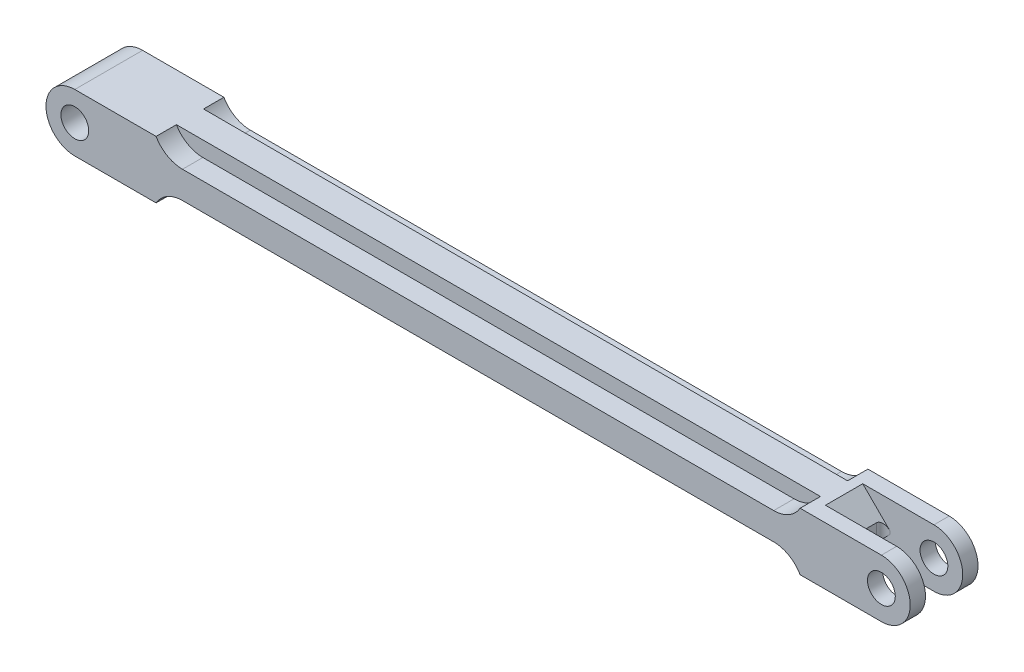
ISO-10303-21;
HEADER;
FILE_DESCRIPTION(('STEP AP214'),'2;1');
FILE_NAME('part.step','',(''),(''),'','','');
FILE_SCHEMA(('AUTOMOTIVE_DESIGN { 1 0 10303 214 1 1 1 1 }'));
ENDSEC;
DATA;
#1=APPLICATION_CONTEXT('core data for automotive mechanical design processes');
#2=APPLICATION_PROTOCOL_DEFINITION('international standard','automotive_design',2000,#1);
#3=PRODUCT_CONTEXT('',#1,'mechanical');
#4=PRODUCT('Part','Part','',(#3));
#5=PRODUCT_RELATED_PRODUCT_CATEGORY('part','',(#4));
#6=PRODUCT_DEFINITION_FORMATION('','',#4);
#7=PRODUCT_DEFINITION_CONTEXT('part definition',#1,'design');
#8=PRODUCT_DEFINITION('design','',#6,#7);
#9=PRODUCT_DEFINITION_SHAPE('','',#8);
#10=(LENGTH_UNIT() NAMED_UNIT(*) SI_UNIT(.MILLI.,.METRE.));
#11=(NAMED_UNIT(*) PLANE_ANGLE_UNIT() SI_UNIT($,.RADIAN.));
#12=(NAMED_UNIT(*) SI_UNIT($,.STERADIAN.) SOLID_ANGLE_UNIT());
#13=UNCERTAINTY_MEASURE_WITH_UNIT(LENGTH_MEASURE(1.E-05),#10,'distance_accuracy_value','');
#14=(GEOMETRIC_REPRESENTATION_CONTEXT(3) GLOBAL_UNCERTAINTY_ASSIGNED_CONTEXT((#13)) GLOBAL_UNIT_ASSIGNED_CONTEXT((#10,
#11,#12)) REPRESENTATION_CONTEXT('',''));
#15=CARTESIAN_POINT('',(0.,0.,0.));
#16=DIRECTION('',(0.,0.,1.));
#17=DIRECTION('',(1.,0.,0.));
#18=AXIS2_PLACEMENT_3D('',#15,#16,#17);
#19=CARTESIAN_POINT('',(-29.0717121826814,171.373872766802,10.));
#20=DIRECTION('',(0.,1.,0.));
#21=DIRECTION('',(0.,0.,1.));
#22=AXIS2_PLACEMENT_3D('',#19,#20,#21);
#23=PLANE('',#22);
#24=DIRECTION('',(-1.,0.,0.));
#25=VECTOR('',#24,1.);
#26=CARTESIAN_POINT('',(217.38140451995,171.373872766802,-5.5));
#27=LINE('',#26,#25);
#28=CARTESIAN_POINT('',(208.88140451995,171.373872766802,-5.5));
#29=VERTEX_POINT('',#28);
#30=CARTESIAN_POINT('',(187.88140451995,171.373872766802,-5.5));
#31=VERTEX_POINT('',#30);
#32=EDGE_CURVE('E220',#29,#31,#27,.T.);
#33=ORIENTED_EDGE('',*,*,#32,.T.);
#34=DIRECTION('',(0.,0.,1.));
#35=VECTOR('',#34,1.);
#36=CARTESIAN_POINT('',(187.88140451995,171.373872766802,-5.5));
#37=LINE('',#36,#35);
#38=CARTESIAN_POINT('',(187.88140451995,171.373872766802,5.5));
#39=VERTEX_POINT('',#38);
#40=EDGE_CURVE('E222',#31,#39,#37,.T.);
#41=ORIENTED_EDGE('',*,*,#40,.T.);
#42=DIRECTION('',(1.,0.,0.));
#43=VECTOR('',#42,1.);
#44=CARTESIAN_POINT('',(217.38140451995,171.373872766802,5.5));
#45=LINE('',#44,#43);
#46=CARTESIAN_POINT('',(208.88140451995,171.373872766802,5.5));
#47=VERTEX_POINT('',#46);
#48=EDGE_CURVE('E226',#39,#47,#45,.T.);
#49=ORIENTED_EDGE('',*,*,#48,.T.);
#50=DIRECTION('',(0.,0.,-1.));
#51=VECTOR('',#50,1.);
#52=CARTESIAN_POINT('',(208.88140451995,171.373872766802,10.));
#53=LINE('',#52,#51);
#54=CARTESIAN_POINT('',(208.88140451995,171.373872766802,10.));
#55=VERTEX_POINT('',#54);
#56=EDGE_CURVE('E284',#55,#47,#53,.T.);
#57=ORIENTED_EDGE('',*,*,#56,.F.);
#58=DIRECTION('',(1.,0.,0.));
#59=VECTOR('',#58,1.);
#60=CARTESIAN_POINT('',(-29.0717121826814,171.373872766802,10.));
#61=LINE('',#60,#59);
#62=CARTESIAN_POINT('',(184.904846168634,171.373872766802,10.));
#63=VERTEX_POINT('',#62);
#64=EDGE_CURVE('E297',#63,#55,#61,.T.);
#65=ORIENTED_EDGE('',*,*,#64,.F.);
#66=DIRECTION('',(0.,0.,-1.));
#67=VECTOR('',#66,1.);
#68=CARTESIAN_POINT('',(184.904846168634,171.373872766802,10.));
#69=LINE('',#68,#67);
#70=CARTESIAN_POINT('',(184.904846168634,171.373872766802,4.00000000000001));
#71=VERTEX_POINT('',#70);
#72=EDGE_CURVE('E311',#63,#71,#69,.T.);
#73=ORIENTED_EDGE('',*,*,#72,.T.);
#74=DIRECTION('',(-1.,0.,0.));
#75=VECTOR('',#74,1.);
#76=CARTESIAN_POINT('',(211.153655665448,171.373872766802,4.00000000000001));
#77=LINE('',#76,#75);
#78=CARTESIAN_POINT('',(-5.09515383136561,171.373872766802,4.00000000000001));
#79=VERTEX_POINT('',#78);
#80=EDGE_CURVE('E332',#71,#79,#77,.T.);
#81=ORIENTED_EDGE('',*,*,#80,.T.);
#82=DIRECTION('',(0.,0.,1.));
#83=VECTOR('',#82,1.);
#84=CARTESIAN_POINT('',(-5.09515383136561,171.373872766802,10.));
#85=LINE('',#84,#83);
#86=CARTESIAN_POINT('',(-5.09515383136561,171.373872766802,10.));
#87=VERTEX_POINT('',#86);
#88=EDGE_CURVE('E352',#79,#87,#85,.T.);
#89=ORIENTED_EDGE('',*,*,#88,.T.);
#90=DIRECTION('',(1.,0.,0.));
#91=VECTOR('',#90,1.);
#92=CARTESIAN_POINT('',(-29.0717121826814,171.373872766802,10.));
#93=LINE('',#92,#91);
#94=CARTESIAN_POINT('',(-29.0717121826814,171.373872766802,10.));
#95=VERTEX_POINT('',#94);
#96=EDGE_CURVE('E367',#95,#87,#93,.T.);
#97=ORIENTED_EDGE('',*,*,#96,.F.);
#98=DIRECTION('',(0.,0.,-1.));
#99=VECTOR('',#98,1.);
#100=CARTESIAN_POINT('',(-29.0717121826814,171.373872766802,10.));
#101=LINE('',#100,#99);
#102=CARTESIAN_POINT('',(-29.0717121826814,171.373872766802,-10.));
#103=VERTEX_POINT('',#102);
#104=EDGE_CURVE('E382',#95,#103,#101,.T.);
#105=ORIENTED_EDGE('',*,*,#104,.T.);
#106=DIRECTION('',(1.,0.,0.));
#107=VECTOR('',#106,1.);
#108=CARTESIAN_POINT('',(-29.0717121826814,171.373872766802,-10.));
#109=LINE('',#108,#107);
#110=CARTESIAN_POINT('',(-5.09515383136561,171.373872766802,-10.));
#111=VERTEX_POINT('',#110);
#112=EDGE_CURVE('E376',#103,#111,#109,.T.);
#113=ORIENTED_EDGE('',*,*,#112,.T.);
#114=CARTESIAN_POINT('',(-5.09515383136561,171.373872766802,-4.));
#115=VERTEX_POINT('',#114);
#116=EDGE_CURVE('E355',#111,#115,#85,.T.);
#117=ORIENTED_EDGE('',*,*,#116,.T.);
#118=DIRECTION('',(-1.,0.,0.));
#119=VECTOR('',#118,1.);
#120=CARTESIAN_POINT('',(211.153655665448,171.373872766802,-4.));
#121=LINE('',#120,#119);
#122=CARTESIAN_POINT('',(184.904846168634,171.373872766802,-4.));
#123=VERTEX_POINT('',#122);
#124=EDGE_CURVE('E335',#123,#115,#121,.T.);
#125=ORIENTED_EDGE('',*,*,#124,.F.);
#126=CARTESIAN_POINT('',(184.904846168634,171.373872766802,-10.));
#127=VERTEX_POINT('',#126);
#128=EDGE_CURVE('E301',#123,#127,#69,.T.);
#129=ORIENTED_EDGE('',*,*,#128,.T.);
#130=DIRECTION('',(1.,0.,0.));
#131=VECTOR('',#130,1.);
#132=CARTESIAN_POINT('',(-29.0717121826814,171.373872766802,-10.));
#133=LINE('',#132,#131);
#134=CARTESIAN_POINT('',(208.88140451995,171.373872766802,-10.));
#135=VERTEX_POINT('',#134);
#136=EDGE_CURVE('E227',#127,#135,#133,.T.);
#137=ORIENTED_EDGE('',*,*,#136,.T.);
#138=EDGE_CURVE('E224',#29,#135,#53,.T.);
#139=ORIENTED_EDGE('',*,*,#138,.F.);
#140=EDGE_LOOP('',(#33,#41,#49,#57,#65,#73,#81,#89,#97,#105,#113,#117,#125,#129,#137,#139));
#141=FACE_BOUND('',#140,.T.);
#142=ADVANCED_FACE('F32',(#141),#23,.F.);
#143=CARTESIAN_POINT('',(193.88140451995,171.373872766802,-5.5));
#144=DIRECTION('',(-1.,0.,0.));
#145=DIRECTION('',(0.,0.,1.));
#146=AXIS2_PLACEMENT_3D('',#143,#144,#145);
#147=PLANE('',#146);
#148=DIRECTION('',(0.,0.,1.));
#149=VECTOR('',#148,1.);
#150=CARTESIAN_POINT('',(193.88140451995,177.373872766802,-5.5));
#151=LINE('',#150,#149);
#152=CARTESIAN_POINT('',(193.88140451995,177.373872766802,-3.5));
#153=VERTEX_POINT('',#152);
#154=CARTESIAN_POINT('',(193.88140451995,177.373872766802,3.5));
#155=VERTEX_POINT('',#154);
#156=EDGE_CURVE('E236',#153,#155,#151,.T.);
#157=ORIENTED_EDGE('',*,*,#156,.F.);
#158=DIRECTION('',(0.,1.,0.));
#159=VECTOR('',#158,1.);
#160=CARTESIAN_POINT('',(193.88140451995,188.373872766802,-3.5));
#161=LINE('',#160,#159);
#162=CARTESIAN_POINT('',(193.88140451995,182.373872766802,-3.5));
#163=VERTEX_POINT('',#162);
#164=EDGE_CURVE('E271',#153,#163,#161,.T.);
#165=ORIENTED_EDGE('',*,*,#164,.T.);
#166=DIRECTION('',(0.,0.,1.));
#167=VECTOR('',#166,1.);
#168=CARTESIAN_POINT('',(193.88140451995,182.373872766802,-5.5));
#169=LINE('',#168,#167);
#170=CARTESIAN_POINT('',(193.88140451995,182.373872766802,3.5));
#171=VERTEX_POINT('',#170);
#172=EDGE_CURVE('E254',#163,#171,#169,.T.);
#173=ORIENTED_EDGE('',*,*,#172,.T.);
#174=DIRECTION('',(0.,1.,0.));
#175=VECTOR('',#174,1.);
#176=CARTESIAN_POINT('',(193.88140451995,171.373872766802,3.5));
#177=LINE('',#176,#175);
#178=EDGE_CURVE('E267',#171,#155,#177,.F.);
#179=ORIENTED_EDGE('',*,*,#178,.T.);
#180=EDGE_LOOP('',(#157,#165,#173,#179));
#181=FACE_BOUND('',#180,.T.);
#182=ADVANCED_FACE('F449',(#181),#147,.F.);
#183=CARTESIAN_POINT('',(195.88140451995,171.373872766802,3.5));
#184=DIRECTION('',(0.,-1.,0.));
#185=DIRECTION('',(0.,0.,-1.));
#186=AXIS2_PLACEMENT_3D('',#183,#184,#185);
#187=CYLINDRICAL_SURFACE('',#186,2.);
#188=CARTESIAN_POINT('',(195.88140451995,179.373872766802,3.5));
#189=DIRECTION('',(0.707106781186543,-0.707106781186552,0.));
#190=DIRECTION('',(-0.707106781186552,-0.707106781186543,0.));
#191=AXIS2_PLACEMENT_3D('',#188,#189,#190);
#192=ELLIPSE('',#191,2.82842712474617,2.);
#193=CARTESIAN_POINT('',(195.88140451995,179.373872766802,5.5));
#194=VERTEX_POINT('',#193);
#195=EDGE_CURVE('E245',#155,#194,#192,.F.);
#196=ORIENTED_EDGE('',*,*,#195,.F.);
#197=ORIENTED_EDGE('',*,*,#178,.F.);
#198=CARTESIAN_POINT('',(195.88140451995,180.373872766802,3.5));
#199=DIRECTION('',(-0.707106781186543,-0.707106781186552,0.));
#200=DIRECTION('',(0.707106781186552,-0.707106781186543,0.));
#201=AXIS2_PLACEMENT_3D('',#198,#199,#200);
#202=ELLIPSE('',#201,2.82842712474617,2.);
#203=CARTESIAN_POINT('',(195.88140451995,180.373872766802,5.5));
#204=VERTEX_POINT('',#203);
#205=EDGE_CURVE('E257',#171,#204,#202,.F.);
#206=ORIENTED_EDGE('',*,*,#205,.T.);
#207=DIRECTION('',(0.,1.,0.));
#208=VECTOR('',#207,1.);
#209=CARTESIAN_POINT('',(195.88140451995,188.373872766802,5.5));
#210=LINE('',#209,#208);
#211=EDGE_CURVE('E274',#194,#204,#210,.T.);
#212=ORIENTED_EDGE('',*,*,#211,.F.);
#213=EDGE_LOOP('',(#196,#197,#206,#212));
#214=FACE_BOUND('',#213,.T.);
#215=ADVANCED_FACE('F452',(#214),#187,.F.);
#216=CARTESIAN_POINT('',(195.88140451995,171.373872766802,-3.5));
#217=DIRECTION('',(0.,-1.,0.));
#218=DIRECTION('',(0.,0.,-1.));
#219=AXIS2_PLACEMENT_3D('',#216,#217,#218);
#220=CYLINDRICAL_SURFACE('',#219,2.);
#221=CARTESIAN_POINT('',(195.88140451995,179.373872766802,-3.5));
#222=DIRECTION('',(0.707106781186543,-0.707106781186552,0.));
#223=DIRECTION('',(-0.707106781186552,-0.707106781186543,0.));
#224=AXIS2_PLACEMENT_3D('',#221,#222,#223);
#225=ELLIPSE('',#224,2.82842712474617,2.);
#226=CARTESIAN_POINT('',(195.88140451995,179.373872766802,-5.5));
#227=VERTEX_POINT('',#226);
#228=EDGE_CURVE('E11',#227,#153,#225,.F.);
#229=ORIENTED_EDGE('',*,*,#228,.F.);
#230=DIRECTION('',(0.,1.,0.));
#231=VECTOR('',#230,1.);
#232=CARTESIAN_POINT('',(195.88140451995,171.373872766802,-5.5));
#233=LINE('',#232,#231);
#234=CARTESIAN_POINT('',(195.88140451995,180.373872766802,-5.5));
#235=VERTEX_POINT('',#234);
#236=EDGE_CURVE('E240',#235,#227,#233,.F.);
#237=ORIENTED_EDGE('',*,*,#236,.F.);
#238=CARTESIAN_POINT('',(195.88140451995,180.373872766802,-3.5));
#239=DIRECTION('',(-0.707106781186543,-0.707106781186552,0.));
#240=DIRECTION('',(0.707106781186552,-0.707106781186543,0.));
#241=AXIS2_PLACEMENT_3D('',#238,#239,#240);
#242=ELLIPSE('',#241,2.82842712474617,2.);
#243=EDGE_CURVE('E40',#235,#163,#242,.F.);
#244=ORIENTED_EDGE('',*,*,#243,.T.);
#245=ORIENTED_EDGE('',*,*,#164,.F.);
#246=EDGE_LOOP('',(#229,#237,#244,#245));
#247=FACE_BOUND('',#246,.T.);
#248=ADVANCED_FACE('F441',(#247),#220,.F.);
#249=CARTESIAN_POINT('',(-29.0717121826814,188.373872766802,10.));
#250=DIRECTION('',(0.,-1.,0.));
#251=DIRECTION('',(0.,0.,-1.));
#252=AXIS2_PLACEMENT_3D('',#249,#250,#251);
#253=PLANE('',#252);
#254=DIRECTION('',(0.,0.,1.));
#255=VECTOR('',#254,1.);
#256=CARTESIAN_POINT('',(187.88140451995,188.373872766802,-5.5));
#257=LINE('',#256,#255);
#258=CARTESIAN_POINT('',(187.88140451995,188.373872766802,-5.5));
#259=VERTEX_POINT('',#258);
#260=CARTESIAN_POINT('',(187.88140451995,188.373872766802,5.5));
#261=VERTEX_POINT('',#260);
#262=EDGE_CURVE('E249',#259,#261,#257,.T.);
#263=ORIENTED_EDGE('',*,*,#262,.F.);
#264=DIRECTION('',(-1.,0.,0.));
#265=VECTOR('',#264,1.);
#266=CARTESIAN_POINT('',(217.38140451995,188.373872766802,-5.5));
#267=LINE('',#266,#265);
#268=CARTESIAN_POINT('',(208.88140451995,188.373872766802,-5.5));
#269=VERTEX_POINT('',#268);
#270=EDGE_CURVE('E268',#269,#259,#267,.T.);
#271=ORIENTED_EDGE('',*,*,#270,.F.);
#272=DIRECTION('',(0.,0.,-1.));
#273=VECTOR('',#272,1.);
#274=CARTESIAN_POINT('',(208.88140451995,188.373872766802,10.));
#275=LINE('',#274,#273);
#276=CARTESIAN_POINT('',(208.88140451995,188.373872766802,-10.));
#277=VERTEX_POINT('',#276);
#278=EDGE_CURVE('E280',#269,#277,#275,.T.);
#279=ORIENTED_EDGE('',*,*,#278,.T.);
#280=DIRECTION('',(-1.,0.,0.));
#281=VECTOR('',#280,1.);
#282=CARTESIAN_POINT('',(-29.0717121826814,188.373872766802,-10.));
#283=LINE('',#282,#281);
#284=CARTESIAN_POINT('',(184.904846168634,188.373872766802,-10.));
#285=VERTEX_POINT('',#284);
#286=EDGE_CURVE('E293',#277,#285,#283,.T.);
#287=ORIENTED_EDGE('',*,*,#286,.T.);
#288=DIRECTION('',(0.,0.,1.));
#289=VECTOR('',#288,1.);
#290=CARTESIAN_POINT('',(184.904846168634,188.373872766802,10.));
#291=LINE('',#290,#289);
#292=CARTESIAN_POINT('',(184.904846168634,188.373872766802,-4.));
#293=VERTEX_POINT('',#292);
#294=EDGE_CURVE('E261',#285,#293,#291,.T.);
#295=ORIENTED_EDGE('',*,*,#294,.T.);
#296=DIRECTION('',(-1.,0.,0.));
#297=VECTOR('',#296,1.);
#298=CARTESIAN_POINT('',(211.153655665448,188.373872766802,-4.));
#299=LINE('',#298,#297);
#300=CARTESIAN_POINT('',(-5.09515383136561,188.373872766802,-4.));
#301=VERTEX_POINT('',#300);
#302=EDGE_CURVE('E349',#293,#301,#299,.T.);
#303=ORIENTED_EDGE('',*,*,#302,.T.);
#304=DIRECTION('',(0.,0.,-1.));
#305=VECTOR('',#304,1.);
#306=CARTESIAN_POINT('',(-5.09515383136561,188.373872766802,10.));
#307=LINE('',#306,#305);
#308=CARTESIAN_POINT('',(-5.09515383136561,188.373872766802,-10.));
#309=VERTEX_POINT('',#308);
#310=EDGE_CURVE('E385',#301,#309,#307,.T.);
#311=ORIENTED_EDGE('',*,*,#310,.T.);
#312=DIRECTION('',(-1.,0.,0.));
#313=VECTOR('',#312,1.);
#314=CARTESIAN_POINT('',(-29.0717121826814,188.373872766802,-10.));
#315=LINE('',#314,#313);
#316=CARTESIAN_POINT('',(-29.0717121826814,188.373872766802,-10.));
#317=VERTEX_POINT('',#316);
#318=EDGE_CURVE('E368',#309,#317,#315,.T.);
#319=ORIENTED_EDGE('',*,*,#318,.T.);
#320=DIRECTION('',(0.,0.,-1.));
#321=VECTOR('',#320,1.);
#322=CARTESIAN_POINT('',(-29.0717121826814,188.373872766802,10.));
#323=LINE('',#322,#321);
#324=CARTESIAN_POINT('',(-29.0717121826814,188.373872766802,10.));
#325=VERTEX_POINT('',#324);
#326=EDGE_CURVE('E373',#325,#317,#323,.T.);
#327=ORIENTED_EDGE('',*,*,#326,.F.);
#328=DIRECTION('',(-1.,0.,0.));
#329=VECTOR('',#328,1.);
#330=CARTESIAN_POINT('',(-29.0717121826814,188.373872766802,10.));
#331=LINE('',#330,#329);
#332=CARTESIAN_POINT('',(-5.09515383136561,188.373872766802,10.));
#333=VERTEX_POINT('',#332);
#334=EDGE_CURVE('E371',#333,#325,#331,.T.);
#335=ORIENTED_EDGE('',*,*,#334,.F.);
#336=CARTESIAN_POINT('',(-5.09515383136561,188.373872766802,4.));
#337=VERTEX_POINT('',#336);
#338=EDGE_CURVE('E386',#333,#337,#307,.T.);
#339=ORIENTED_EDGE('',*,*,#338,.T.);
#340=DIRECTION('',(-1.,0.,0.));
#341=VECTOR('',#340,1.);
#342=CARTESIAN_POINT('',(211.153655665448,188.373872766802,4.));
#343=LINE('',#342,#341);
#344=CARTESIAN_POINT('',(184.904846168634,188.373872766802,4.));
#345=VERTEX_POINT('',#344);
#346=EDGE_CURVE('E273',#345,#337,#343,.T.);
#347=ORIENTED_EDGE('',*,*,#346,.F.);
#348=CARTESIAN_POINT('',(184.904846168634,188.373872766802,10.));
#349=VERTEX_POINT('',#348);
#350=EDGE_CURVE('E265',#345,#349,#291,.T.);
#351=ORIENTED_EDGE('',*,*,#350,.T.);
#352=DIRECTION('',(-1.,0.,0.));
#353=VECTOR('',#352,1.);
#354=CARTESIAN_POINT('',(-29.0717121826814,188.373872766802,10.));
#355=LINE('',#354,#353);
#356=CARTESIAN_POINT('',(208.88140451995,188.373872766802,10.));
#357=VERTEX_POINT('',#356);
#358=EDGE_CURVE('E296',#357,#349,#355,.T.);
#359=ORIENTED_EDGE('',*,*,#358,.F.);
#360=CARTESIAN_POINT('',(208.88140451995,188.373872766802,5.5));
#361=VERTEX_POINT('',#360);
#362=EDGE_CURVE('E264',#357,#361,#275,.T.);
#363=ORIENTED_EDGE('',*,*,#362,.T.);
#364=DIRECTION('',(1.,0.,0.));
#365=VECTOR('',#364,1.);
#366=CARTESIAN_POINT('',(217.38140451995,188.373872766802,5.5));
#367=LINE('',#366,#365);
#368=EDGE_CURVE('E276',#261,#361,#367,.T.);
#369=ORIENTED_EDGE('',*,*,#368,.F.);
#370=EDGE_LOOP('',(#263,#271,#279,#287,#295,#303,#311,#319,#327,#335,#339,#347,#351,#359,#363,#369));
#371=FACE_BOUND('',#370,.T.);
#372=ADVANCED_FACE('F506',(#371),#253,.F.);
#373=CARTESIAN_POINT('',(-29.0717121826814,179.873872766802,10.));
#374=DIRECTION('',(0.,0.,-1.));
#375=DIRECTION('',(-1.,0.,0.));
#376=AXIS2_PLACEMENT_3D('',#373,#374,#375);
#377=CYLINDRICAL_SURFACE('',#376,4.1);
#378=CARTESIAN_POINT('',(-29.0717121826814,179.873872766802,10.));
#379=DIRECTION('',(0.,0.,1.));
#380=DIRECTION('',(1.,0.,0.));
#381=AXIS2_PLACEMENT_3D('',#378,#379,#380);
#382=CIRCLE('',#381,4.1);
#383=CARTESIAN_POINT('',(-24.9717121826814,179.873872766802,10.));
#384=VERTEX_POINT('',#383);
#385=EDGE_CURVE('E358',#384,#384,#382,.T.);
#386=ORIENTED_EDGE('',*,*,#385,.T.);
#387=EDGE_LOOP('',(#386));
#388=FACE_BOUND('',#387,.T.);
#389=CARTESIAN_POINT('',(-29.0717121826814,179.873872766802,-10.));
#390=DIRECTION('',(0.,0.,1.));
#391=DIRECTION('',(1.,0.,0.));
#392=AXIS2_PLACEMENT_3D('',#389,#390,#391);
#393=CIRCLE('',#392,4.1);
#394=CARTESIAN_POINT('',(-24.9717121826814,179.873872766802,-10.));
#395=VERTEX_POINT('',#394);
#396=EDGE_CURVE('E357',#395,#395,#393,.T.);
#397=ORIENTED_EDGE('',*,*,#396,.F.);
#398=EDGE_LOOP('',(#397));
#399=FACE_BOUND('',#398,.T.);
#400=ADVANCED_FACE('F512',(#388,#399),#377,.F.);
#401=CARTESIAN_POINT('',(-29.0717121826814,179.873872766802,10.));
#402=DIRECTION('',(0.,0.,-1.));
#403=DIRECTION('',(-1.,0.,0.));
#404=AXIS2_PLACEMENT_3D('',#401,#402,#403);
#405=CYLINDRICAL_SURFACE('',#404,8.50000000000001);
#406=CARTESIAN_POINT('',(-29.0717121826814,179.873872766802,-10.));
#407=DIRECTION('',(0.,0.,1.));
#408=DIRECTION('',(1.,0.,0.));
#409=AXIS2_PLACEMENT_3D('',#406,#407,#408);
#410=CIRCLE('',#409,8.50000000000001);
#411=EDGE_CURVE('E361',#317,#103,#410,.T.);
#412=ORIENTED_EDGE('',*,*,#411,.T.);
#413=ORIENTED_EDGE('',*,*,#104,.F.);
#414=CARTESIAN_POINT('',(-29.0717121826814,179.873872766802,10.));
#415=DIRECTION('',(0.,0.,1.));
#416=DIRECTION('',(1.,0.,0.));
#417=AXIS2_PLACEMENT_3D('',#414,#415,#416);
#418=CIRCLE('',#417,8.50000000000001);
#419=EDGE_CURVE('E364',#325,#95,#418,.T.);
#420=ORIENTED_EDGE('',*,*,#419,.F.);
#421=ORIENTED_EDGE('',*,*,#326,.T.);
#422=EDGE_LOOP('',(#412,#413,#420,#421));
#423=FACE_BOUND('',#422,.T.);
#424=ADVANCED_FACE('F508',(#423),#405,.T.);
#425=CARTESIAN_POINT('',(-29.0717121826814,179.873872766802,-10.));
#426=DIRECTION('',(0.,0.,1.));
#427=DIRECTION('',(1.,0.,0.));
#428=AXIS2_PLACEMENT_3D('',#425,#426,#427);
#429=PLANE('',#428);
#430=ORIENTED_EDGE('',*,*,#396,.T.);
#431=EDGE_LOOP('',(#430));
#432=FACE_BOUND('',#431,.T.);
#433=ORIENTED_EDGE('',*,*,#318,.F.);
#434=CARTESIAN_POINT('',(2.69907480269432,192.873872766802,-10.));
#435=DIRECTION('',(0.,0.,1.));
#436=DIRECTION('',(1.,0.,0.));
#437=AXIS2_PLACEMENT_3D('',#434,#435,#436);
#438=CIRCLE('',#437,9.);
#439=CARTESIAN_POINT('',(2.69907480269438,183.873872766802,-10.));
#440=VERTEX_POINT('',#439);
#441=EDGE_CURVE('E55',#309,#440,#438,.T.);
#442=ORIENTED_EDGE('',*,*,#441,.T.);
#443=DIRECTION('',(-1.,0.,0.));
#444=VECTOR('',#443,1.);
#445=CARTESIAN_POINT('',(211.153655665448,183.873872766802,-10.));
#446=LINE('',#445,#444);
#447=CARTESIAN_POINT('',(177.110617534574,183.873872766802,-10.));
#448=VERTEX_POINT('',#447);
#449=EDGE_CURVE('E344',#448,#440,#446,.T.);
#450=ORIENTED_EDGE('',*,*,#449,.F.);
#451=CARTESIAN_POINT('',(177.110617534574,192.873872766802,-10.));
#452=DIRECTION('',(0.,0.,1.));
#453=DIRECTION('',(1.,0.,0.));
#454=AXIS2_PLACEMENT_3D('',#451,#452,#453);
#455=CIRCLE('',#454,9.);
#456=EDGE_CURVE('E430',#448,#285,#455,.T.);
#457=ORIENTED_EDGE('',*,*,#456,.T.);
#458=ORIENTED_EDGE('',*,*,#286,.F.);
#459=CARTESIAN_POINT('',(208.88140451995,179.873872766802,-10.));
#460=DIRECTION('',(0.,0.,1.));
#461=DIRECTION('',(1.,0.,0.));
#462=AXIS2_PLACEMENT_3D('',#459,#460,#461);
#463=CIRCLE('',#462,8.50000000000001);
#464=EDGE_CURVE('E290',#135,#277,#463,.T.);
#465=ORIENTED_EDGE('',*,*,#464,.F.);
#466=ORIENTED_EDGE('',*,*,#136,.F.);
#467=CARTESIAN_POINT('',(177.110617534574,166.873872766802,-10.));
#468=DIRECTION('',(0.,0.,1.));
#469=DIRECTION('',(1.,0.,0.));
#470=AXIS2_PLACEMENT_3D('',#467,#468,#469);
#471=CIRCLE('',#470,9.);
#472=CARTESIAN_POINT('',(177.110617534574,175.873872766802,-10.));
#473=VERTEX_POINT('',#472);
#474=EDGE_CURVE('E426',#127,#473,#471,.T.);
#475=ORIENTED_EDGE('',*,*,#474,.T.);
#476=DIRECTION('',(-1.,0.,0.));
#477=VECTOR('',#476,1.);
#478=CARTESIAN_POINT('',(211.153655665448,175.873872766802,-10.));
#479=LINE('',#478,#477);
#480=CARTESIAN_POINT('',(2.69907480269441,175.873872766802,-10.));
#481=VERTEX_POINT('',#480);
#482=EDGE_CURVE('E341',#473,#481,#479,.T.);
#483=ORIENTED_EDGE('',*,*,#482,.T.);
#484=CARTESIAN_POINT('',(2.69907480269435,166.873872766802,-10.));
#485=DIRECTION('',(0.,0.,1.));
#486=DIRECTION('',(1.,0.,0.));
#487=AXIS2_PLACEMENT_3D('',#484,#485,#486);
#488=CIRCLE('',#487,9.);
#489=EDGE_CURVE('E432',#481,#111,#488,.T.);
#490=ORIENTED_EDGE('',*,*,#489,.T.);
#491=ORIENTED_EDGE('',*,*,#112,.F.);
#492=ORIENTED_EDGE('',*,*,#411,.F.);
#493=EDGE_LOOP('',(#433,#442,#450,#457,#458,#465,#466,#475,#483,#490,#491,#492));
#494=FACE_BOUND('',#493,.T.);
#495=CARTESIAN_POINT('',(208.88140451995,179.873872766802,-10.));
#496=DIRECTION('',(0.,0.,1.));
#497=DIRECTION('',(1.,0.,0.));
#498=AXIS2_PLACEMENT_3D('',#495,#496,#497);
#499=CIRCLE('',#498,4.09999999999998);
#500=CARTESIAN_POINT('',(212.98140451995,179.873872766802,-10.));
#501=VERTEX_POINT('',#500);
#502=EDGE_CURVE('E298',#501,#501,#499,.T.);
#503=ORIENTED_EDGE('',*,*,#502,.T.);
#504=EDGE_LOOP('',(#503));
#505=FACE_BOUND('',#504,.T.);
#506=ADVANCED_FACE('F511',(#432,#494,#505),#429,.F.);
#507=CARTESIAN_POINT('',(-29.0717121826814,179.873872766802,10.));
#508=DIRECTION('',(0.,0.,1.));
#509=DIRECTION('',(1.,0.,0.));
#510=AXIS2_PLACEMENT_3D('',#507,#508,#509);
#511=PLANE('',#510);
#512=DIRECTION('',(-1.,0.,0.));
#513=VECTOR('',#512,1.);
#514=CARTESIAN_POINT('',(211.153655665448,183.873872766802,10.));
#515=LINE('',#514,#513);
#516=CARTESIAN_POINT('',(177.110617534574,183.873872766802,10.));
#517=VERTEX_POINT('',#516);
#518=CARTESIAN_POINT('',(2.69907480269438,183.873872766802,10.));
#519=VERTEX_POINT('',#518);
#520=EDGE_CURVE('E323',#517,#519,#515,.T.);
#521=ORIENTED_EDGE('',*,*,#520,.T.);
#522=CARTESIAN_POINT('',(2.69907480269432,192.873872766802,10.));
#523=DIRECTION('',(0.,0.,1.));
#524=DIRECTION('',(1.,0.,0.));
#525=AXIS2_PLACEMENT_3D('',#522,#523,#524);
#526=CIRCLE('',#525,9.);
#527=EDGE_CURVE('E437',#519,#333,#526,.F.);
#528=ORIENTED_EDGE('',*,*,#527,.T.);
#529=ORIENTED_EDGE('',*,*,#334,.T.);
#530=ORIENTED_EDGE('',*,*,#419,.T.);
#531=ORIENTED_EDGE('',*,*,#96,.T.);
#532=CARTESIAN_POINT('',(2.69907480269435,166.873872766802,10.));
#533=DIRECTION('',(0.,0.,1.));
#534=DIRECTION('',(1.,0.,0.));
#535=AXIS2_PLACEMENT_3D('',#532,#533,#534);
#536=CIRCLE('',#535,9.);
#537=CARTESIAN_POINT('',(2.69907480269441,175.873872766802,10.));
#538=VERTEX_POINT('',#537);
#539=EDGE_CURVE('E435',#87,#538,#536,.F.);
#540=ORIENTED_EDGE('',*,*,#539,.T.);
#541=DIRECTION('',(-1.,0.,0.));
#542=VECTOR('',#541,1.);
#543=CARTESIAN_POINT('',(211.153655665448,175.873872766802,10.));
#544=LINE('',#543,#542);
#545=CARTESIAN_POINT('',(177.110617534574,175.873872766802,10.));
#546=VERTEX_POINT('',#545);
#547=EDGE_CURVE('E326',#546,#538,#544,.T.);
#548=ORIENTED_EDGE('',*,*,#547,.F.);
#549=CARTESIAN_POINT('',(177.110617534574,166.873872766802,10.));
#550=DIRECTION('',(0.,0.,1.));
#551=DIRECTION('',(1.,0.,0.));
#552=AXIS2_PLACEMENT_3D('',#549,#550,#551);
#553=CIRCLE('',#552,9.);
#554=EDGE_CURVE('E424',#546,#63,#553,.F.);
#555=ORIENTED_EDGE('',*,*,#554,.T.);
#556=ORIENTED_EDGE('',*,*,#64,.T.);
#557=CARTESIAN_POINT('',(208.88140451995,179.873872766802,10.));
#558=DIRECTION('',(0.,0.,1.));
#559=DIRECTION('',(1.,0.,0.));
#560=AXIS2_PLACEMENT_3D('',#557,#558,#559);
#561=CIRCLE('',#560,8.50000000000001);
#562=EDGE_CURVE('E294',#55,#357,#561,.T.);
#563=ORIENTED_EDGE('',*,*,#562,.T.);
#564=ORIENTED_EDGE('',*,*,#358,.T.);
#565=CARTESIAN_POINT('',(177.110617534574,192.873872766802,10.));
#566=DIRECTION('',(0.,0.,1.));
#567=DIRECTION('',(1.,0.,0.));
#568=AXIS2_PLACEMENT_3D('',#565,#566,#567);
#569=CIRCLE('',#568,9.);
#570=EDGE_CURVE('E428',#349,#517,#569,.F.);
#571=ORIENTED_EDGE('',*,*,#570,.T.);
#572=EDGE_LOOP('',(#521,#528,#529,#530,#531,#540,#548,#555,#556,#563,#564,#571));
#573=FACE_BOUND('',#572,.T.);
#574=ORIENTED_EDGE('',*,*,#385,.F.);
#575=EDGE_LOOP('',(#574));
#576=FACE_BOUND('',#575,.T.);
#577=CARTESIAN_POINT('',(208.88140451995,179.873872766802,10.));
#578=DIRECTION('',(0.,0.,1.));
#579=DIRECTION('',(1.,0.,0.));
#580=AXIS2_PLACEMENT_3D('',#577,#578,#579);
#581=CIRCLE('',#580,4.09999999999998);
#582=CARTESIAN_POINT('',(212.98140451995,179.873872766802,10.));
#583=VERTEX_POINT('',#582);
#584=EDGE_CURVE('E287',#583,#583,#581,.T.);
#585=ORIENTED_EDGE('',*,*,#584,.F.);
#586=EDGE_LOOP('',(#585));
#587=FACE_BOUND('',#586,.T.);
#588=ADVANCED_FACE('F468',(#573,#576,#587),#511,.T.);
#589=CARTESIAN_POINT('',(211.153655665448,183.873872766802,4.00000000000001));
#590=DIRECTION('',(0.,0.,-1.));
#591=DIRECTION('',(0.,1.,0.));
#592=AXIS2_PLACEMENT_3D('',#589,#590,#591);
#593=PLANE('',#592);
#594=DIRECTION('',(-1.,0.,0.));
#595=VECTOR('',#594,1.);
#596=CARTESIAN_POINT('',(211.153655665448,183.873872766802,4.00000000000001));
#597=LINE('',#596,#595);
#598=CARTESIAN_POINT('',(177.110617534574,183.873872766802,4.00000000000001));
#599=VERTEX_POINT('',#598);
#600=CARTESIAN_POINT('',(2.69907480269432,183.873872766802,4.00000000000001));
#601=VERTEX_POINT('',#600);
#602=EDGE_CURVE('E320',#599,#601,#597,.T.);
#603=ORIENTED_EDGE('',*,*,#602,.F.);
#604=CARTESIAN_POINT('',(177.110617534574,192.873872766802,4.));
#605=DIRECTION('',(0.,0.,-1.));
#606=DIRECTION('',(0.,1.,0.));
#607=AXIS2_PLACEMENT_3D('',#604,#605,#606);
#608=CIRCLE('',#607,9.);
#609=EDGE_CURVE('E413',#599,#345,#608,.F.);
#610=ORIENTED_EDGE('',*,*,#609,.T.);
#611=ORIENTED_EDGE('',*,*,#346,.T.);
#612=CARTESIAN_POINT('',(2.69907480269432,192.873872766802,4.));
#613=DIRECTION('',(0.,0.,-1.));
#614=DIRECTION('',(0.,1.,0.));
#615=AXIS2_PLACEMENT_3D('',#612,#613,#614);
#616=CIRCLE('',#615,9.);
#617=EDGE_CURVE('E411',#337,#601,#616,.F.);
#618=ORIENTED_EDGE('',*,*,#617,.T.);
#619=EDGE_LOOP('',(#603,#610,#611,#618));
#620=FACE_BOUND('',#619,.T.);
#621=ADVANCED_FACE('F549',(#620),#593,.F.);
#622=CARTESIAN_POINT('',(211.153655665448,183.873872766802,10.));
#623=DIRECTION('',(0.,-1.,0.));
#624=DIRECTION('',(1.,0.,0.));
#625=AXIS2_PLACEMENT_3D('',#622,#623,#624);
#626=PLANE('',#625);
#627=ORIENTED_EDGE('',*,*,#520,.F.);
#628=DIRECTION('',(0.,0.,-1.));
#629=VECTOR('',#628,1.);
#630=CARTESIAN_POINT('',(177.110617534574,183.873872766802,10.));
#631=LINE('',#630,#629);
#632=EDGE_CURVE('E409',#517,#599,#631,.T.);
#633=ORIENTED_EDGE('',*,*,#632,.T.);
#634=ORIENTED_EDGE('',*,*,#602,.T.);
#635=DIRECTION('',(0.,0.,1.));
#636=VECTOR('',#635,1.);
#637=CARTESIAN_POINT('',(2.69907480269432,183.873872766802,10.));
#638=LINE('',#637,#636);
#639=EDGE_CURVE('E406',#601,#519,#638,.T.);
#640=ORIENTED_EDGE('',*,*,#639,.T.);
#641=EDGE_LOOP('',(#627,#633,#634,#640));
#642=FACE_BOUND('',#641,.T.);
#643=ADVANCED_FACE('F496',(#642),#626,.F.);
#644=CARTESIAN_POINT('',(211.153655665448,175.873872766802,10.));
#645=DIRECTION('',(0.,1.,0.));
#646=DIRECTION('',(-1.,0.,0.));
#647=AXIS2_PLACEMENT_3D('',#644,#645,#646);
#648=PLANE('',#647);
#649=DIRECTION('',(-1.,0.,0.));
#650=VECTOR('',#649,1.);
#651=CARTESIAN_POINT('',(211.153655665448,175.873872766802,4.00000000000001));
#652=LINE('',#651,#650);
#653=CARTESIAN_POINT('',(177.110617534574,175.873872766802,4.00000000000001));
#654=VERTEX_POINT('',#653);
#655=CARTESIAN_POINT('',(2.69907480269435,175.873872766802,4.00000000000001));
#656=VERTEX_POINT('',#655);
#657=EDGE_CURVE('E329',#654,#656,#652,.T.);
#658=ORIENTED_EDGE('',*,*,#657,.F.);
#659=DIRECTION('',(0.,0.,1.));
#660=VECTOR('',#659,1.);
#661=CARTESIAN_POINT('',(177.110617534574,175.873872766802,10.));
#662=LINE('',#661,#660);
#663=EDGE_CURVE('E395',#654,#546,#662,.T.);
#664=ORIENTED_EDGE('',*,*,#663,.T.);
#665=ORIENTED_EDGE('',*,*,#547,.T.);
#666=DIRECTION('',(0.,0.,-1.));
#667=VECTOR('',#666,1.);
#668=CARTESIAN_POINT('',(2.69907480269435,175.873872766802,10.));
#669=LINE('',#668,#667);
#670=EDGE_CURVE('E392',#538,#656,#669,.T.);
#671=ORIENTED_EDGE('',*,*,#670,.T.);
#672=EDGE_LOOP('',(#658,#664,#665,#671));
#673=FACE_BOUND('',#672,.T.);
#674=ADVANCED_FACE('F484',(#673),#648,.F.);
#675=CARTESIAN_POINT('',(211.153655665448,171.373872766802,4.00000000000001));
#676=DIRECTION('',(0.,0.,-1.));
#677=DIRECTION('',(-1.,0.,0.));
#678=AXIS2_PLACEMENT_3D('',#675,#676,#677);
#679=PLANE('',#678);
#680=ORIENTED_EDGE('',*,*,#80,.F.);
#681=CARTESIAN_POINT('',(177.110617534574,166.873872766802,4.00000000000001));
#682=DIRECTION('',(0.,0.,-1.));
#683=DIRECTION('',(-1.,0.,0.));
#684=AXIS2_PLACEMENT_3D('',#681,#682,#683);
#685=CIRCLE('',#684,9.);
#686=EDGE_CURVE('E390',#71,#654,#685,.F.);
#687=ORIENTED_EDGE('',*,*,#686,.T.);
#688=ORIENTED_EDGE('',*,*,#657,.T.);
#689=CARTESIAN_POINT('',(2.69907480269435,166.873872766802,4.00000000000001));
#690=DIRECTION('',(0.,0.,-1.));
#691=DIRECTION('',(-1.,0.,0.));
#692=AXIS2_PLACEMENT_3D('',#689,#690,#691);
#693=CIRCLE('',#692,9.);
#694=EDGE_CURVE('E388',#656,#79,#693,.F.);
#695=ORIENTED_EDGE('',*,*,#694,.T.);
#696=EDGE_LOOP('',(#680,#687,#688,#695));
#697=FACE_BOUND('',#696,.T.);
#698=ADVANCED_FACE('F485',(#697),#679,.F.);
#699=CARTESIAN_POINT('',(211.153655665448,171.373872766802,-4.));
#700=DIRECTION('',(0.,0.,1.));
#701=DIRECTION('',(0.,-1.,0.));
#702=AXIS2_PLACEMENT_3D('',#699,#700,#701);
#703=PLANE('',#702);
#704=DIRECTION('',(-1.,0.,0.));
#705=VECTOR('',#704,1.);
#706=CARTESIAN_POINT('',(211.153655665448,175.873872766802,-4.));
#707=LINE('',#706,#705);
#708=CARTESIAN_POINT('',(177.110617534574,175.873872766802,-4.));
#709=VERTEX_POINT('',#708);
#710=CARTESIAN_POINT('',(2.69907480269435,175.873872766802,-4.));
#711=VERTEX_POINT('',#710);
#712=EDGE_CURVE('E338',#709,#711,#707,.T.);
#713=ORIENTED_EDGE('',*,*,#712,.F.);
#714=CARTESIAN_POINT('',(177.110617534574,166.873872766802,-4.));
#715=DIRECTION('',(0.,0.,1.));
#716=DIRECTION('',(0.,-1.,0.));
#717=AXIS2_PLACEMENT_3D('',#714,#715,#716);
#718=CIRCLE('',#717,9.);
#719=EDGE_CURVE('E404',#709,#123,#718,.F.);
#720=ORIENTED_EDGE('',*,*,#719,.T.);
#721=ORIENTED_EDGE('',*,*,#124,.T.);
#722=CARTESIAN_POINT('',(2.69907480269435,166.873872766802,-4.));
#723=DIRECTION('',(0.,0.,1.));
#724=DIRECTION('',(0.,-1.,0.));
#725=AXIS2_PLACEMENT_3D('',#722,#723,#724);
#726=CIRCLE('',#725,9.);
#727=EDGE_CURVE('E402',#115,#711,#726,.F.);
#728=ORIENTED_EDGE('',*,*,#727,.T.);
#729=EDGE_LOOP('',(#713,#720,#721,#728));
#730=FACE_BOUND('',#729,.T.);
#731=ADVANCED_FACE('F487',(#730),#703,.F.);
#732=CARTESIAN_POINT('',(211.153655665448,175.873872766802,-4.));
#733=DIRECTION('',(0.,1.,0.));
#734=DIRECTION('',(-1.,0.,0.));
#735=AXIS2_PLACEMENT_3D('',#732,#733,#734);
#736=PLANE('',#735);
#737=ORIENTED_EDGE('',*,*,#482,.F.);
#738=DIRECTION('',(0.,0.,1.));
#739=VECTOR('',#738,1.);
#740=CARTESIAN_POINT('',(177.110617534574,175.873872766802,-4.));
#741=LINE('',#740,#739);
#742=EDGE_CURVE('E400',#473,#709,#741,.T.);
#743=ORIENTED_EDGE('',*,*,#742,.T.);
#744=ORIENTED_EDGE('',*,*,#712,.T.);
#745=DIRECTION('',(0.,0.,-1.));
#746=VECTOR('',#745,1.);
#747=CARTESIAN_POINT('',(2.69907480269435,175.873872766802,-4.));
#748=LINE('',#747,#746);
#749=EDGE_CURVE('E397',#711,#481,#748,.T.);
#750=ORIENTED_EDGE('',*,*,#749,.T.);
#751=EDGE_LOOP('',(#737,#743,#744,#750));
#752=FACE_BOUND('',#751,.T.);
#753=ADVANCED_FACE('F493',(#752),#736,.F.);
#754=CARTESIAN_POINT('',(211.153655665448,183.873872766802,-4.));
#755=DIRECTION('',(0.,-1.,0.));
#756=DIRECTION('',(1.,0.,0.));
#757=AXIS2_PLACEMENT_3D('',#754,#755,#756);
#758=PLANE('',#757);
#759=DIRECTION('',(-1.,0.,0.));
#760=VECTOR('',#759,1.);
#761=CARTESIAN_POINT('',(211.153655665448,183.873872766802,-4.));
#762=LINE('',#761,#760);
#763=CARTESIAN_POINT('',(177.110617534574,183.873872766802,-4.));
#764=VERTEX_POINT('',#763);
#765=CARTESIAN_POINT('',(2.69907480269432,183.873872766802,-4.));
#766=VERTEX_POINT('',#765);
#767=EDGE_CURVE('E346',#764,#766,#762,.T.);
#768=ORIENTED_EDGE('',*,*,#767,.F.);
#769=DIRECTION('',(0.,0.,-1.));
#770=VECTOR('',#769,1.);
#771=CARTESIAN_POINT('',(177.110617534574,183.873872766802,-4.));
#772=LINE('',#771,#770);
#773=EDGE_CURVE('E422',#764,#448,#772,.T.);
#774=ORIENTED_EDGE('',*,*,#773,.T.);
#775=ORIENTED_EDGE('',*,*,#449,.T.);
#776=DIRECTION('',(0.,0.,1.));
#777=VECTOR('',#776,1.);
#778=CARTESIAN_POINT('',(2.69907480269432,183.873872766802,-4.));
#779=LINE('',#778,#777);
#780=EDGE_CURVE('E419',#440,#766,#779,.T.);
#781=ORIENTED_EDGE('',*,*,#780,.T.);
#782=EDGE_LOOP('',(#768,#774,#775,#781));
#783=FACE_BOUND('',#782,.T.);
#784=ADVANCED_FACE('F592',(#783),#758,.F.);
#785=CARTESIAN_POINT('',(211.153655665448,183.873872766802,-4.));
#786=DIRECTION('',(0.,0.,1.));
#787=DIRECTION('',(0.,-1.,0.));
#788=AXIS2_PLACEMENT_3D('',#785,#786,#787);
#789=PLANE('',#788);
#790=ORIENTED_EDGE('',*,*,#302,.F.);
#791=CARTESIAN_POINT('',(177.110617534574,192.873872766802,-4.));
#792=DIRECTION('',(0.,0.,1.));
#793=DIRECTION('',(0.,-1.,0.));
#794=AXIS2_PLACEMENT_3D('',#791,#792,#793);
#795=CIRCLE('',#794,9.);
#796=EDGE_CURVE('E417',#293,#764,#795,.F.);
#797=ORIENTED_EDGE('',*,*,#796,.T.);
#798=ORIENTED_EDGE('',*,*,#767,.T.);
#799=CARTESIAN_POINT('',(2.69907480269432,192.873872766802,-4.));
#800=DIRECTION('',(0.,0.,1.));
#801=DIRECTION('',(0.,-1.,0.));
#802=AXIS2_PLACEMENT_3D('',#799,#800,#801);
#803=CIRCLE('',#802,9.);
#804=EDGE_CURVE('E415',#766,#301,#803,.F.);
#805=ORIENTED_EDGE('',*,*,#804,.T.);
#806=EDGE_LOOP('',(#790,#797,#798,#805));
#807=FACE_BOUND('',#806,.T.);
#808=ADVANCED_FACE('F588',(#807),#789,.F.);
#809=CARTESIAN_POINT('',(208.88140451995,179.873872766802,10.));
#810=DIRECTION('',(0.,0.,-1.));
#811=DIRECTION('',(-1.,0.,0.));
#812=AXIS2_PLACEMENT_3D('',#809,#810,#811);
#813=CYLINDRICAL_SURFACE('',#812,8.50000000000001);
#814=CARTESIAN_POINT('',(208.88140451995,179.873872766802,5.5));
#815=DIRECTION('',(0.,0.,1.));
#816=DIRECTION('',(1.,0.,0.));
#817=AXIS2_PLACEMENT_3D('',#814,#815,#816);
#818=CIRCLE('',#817,8.50000000000001);
#819=EDGE_CURVE('E260',#47,#361,#818,.T.);
#820=ORIENTED_EDGE('',*,*,#819,.T.);
#821=ORIENTED_EDGE('',*,*,#362,.F.);
#822=ORIENTED_EDGE('',*,*,#562,.F.);
#823=ORIENTED_EDGE('',*,*,#56,.T.);
#824=EDGE_LOOP('',(#820,#821,#822,#823));
#825=FACE_BOUND('',#824,.T.);
#826=ADVANCED_FACE('F465',(#825),#813,.T.);
#827=CARTESIAN_POINT('',(208.88140451995,179.873872766802,10.));
#828=DIRECTION('',(0.,0.,-1.));
#829=DIRECTION('',(-1.,0.,0.));
#830=AXIS2_PLACEMENT_3D('',#827,#828,#829);
#831=CYLINDRICAL_SURFACE('',#830,4.09999999999998);
#832=CARTESIAN_POINT('',(208.88140451995,179.873872766802,5.5));
#833=DIRECTION('',(0.,0.,1.));
#834=DIRECTION('',(1.,0.,0.));
#835=AXIS2_PLACEMENT_3D('',#832,#833,#834);
#836=CIRCLE('',#835,4.09999999999998);
#837=CARTESIAN_POINT('',(212.98140451995,179.873872766802,5.5));
#838=VERTEX_POINT('',#837);
#839=EDGE_CURVE('E277',#838,#838,#836,.T.);
#840=ORIENTED_EDGE('',*,*,#839,.F.);
#841=EDGE_LOOP('',(#840));
#842=FACE_BOUND('',#841,.T.);
#843=ORIENTED_EDGE('',*,*,#584,.T.);
#844=EDGE_LOOP('',(#843));
#845=FACE_BOUND('',#844,.T.);
#846=ADVANCED_FACE('F611',(#842,#845),#831,.F.);
#847=ORIENTED_EDGE('',*,*,#278,.F.);
#848=CARTESIAN_POINT('',(208.88140451995,179.873872766802,-5.5));
#849=DIRECTION('',(0.,0.,-1.));
#850=DIRECTION('',(-1.,0.,0.));
#851=AXIS2_PLACEMENT_3D('',#848,#849,#850);
#852=CIRCLE('',#851,8.50000000000001);
#853=EDGE_CURVE('E306',#269,#29,#852,.T.);
#854=ORIENTED_EDGE('',*,*,#853,.T.);
#855=ORIENTED_EDGE('',*,*,#138,.T.);
#856=ORIENTED_EDGE('',*,*,#464,.T.);
#857=EDGE_LOOP('',(#847,#854,#855,#856));
#858=FACE_BOUND('',#857,.T.);
#859=ADVANCED_FACE('F580',(#858),#813,.T.);
#860=CARTESIAN_POINT('',(208.88140451995,179.873872766802,-5.5));
#861=DIRECTION('',(0.,0.,-1.));
#862=DIRECTION('',(-1.,0.,0.));
#863=AXIS2_PLACEMENT_3D('',#860,#861,#862);
#864=CIRCLE('',#863,4.09999999999998);
#865=CARTESIAN_POINT('',(204.78140451995,179.873872766802,-5.5));
#866=VERTEX_POINT('',#865);
#867=EDGE_CURVE('E281',#866,#866,#864,.T.);
#868=ORIENTED_EDGE('',*,*,#867,.F.);
#869=EDGE_LOOP('',(#868));
#870=FACE_BOUND('',#869,.T.);
#871=ORIENTED_EDGE('',*,*,#502,.F.);
#872=EDGE_LOOP('',(#871));
#873=FACE_BOUND('',#872,.T.);
#874=ADVANCED_FACE('F603',(#870,#873),#831,.F.);
#875=CARTESIAN_POINT('',(217.38140451995,171.373872766802,5.5));
#876=DIRECTION('',(0.,0.,1.));
#877=DIRECTION('',(1.,0.,0.));
#878=AXIS2_PLACEMENT_3D('',#875,#876,#877);
#879=PLANE('',#878);
#880=ORIENTED_EDGE('',*,*,#819,.F.);
#881=ORIENTED_EDGE('',*,*,#48,.F.);
#882=DIRECTION('',(0.707106781186552,0.707106781186543,0.));
#883=VECTOR('',#882,1.);
#884=CARTESIAN_POINT('',(187.88140451995,171.373872766802,5.5));
#885=LINE('',#884,#883);
#886=EDGE_CURVE('E235',#39,#194,#885,.T.);
#887=ORIENTED_EDGE('',*,*,#886,.T.);
#888=ORIENTED_EDGE('',*,*,#211,.T.);
#889=DIRECTION('',(0.707106781186552,-0.707106781186543,0.));
#890=VECTOR('',#889,1.);
#891=CARTESIAN_POINT('',(187.88140451995,188.373872766802,5.5));
#892=LINE('',#891,#890);
#893=EDGE_CURVE('E247',#261,#204,#892,.T.);
#894=ORIENTED_EDGE('',*,*,#893,.F.);
#895=ORIENTED_EDGE('',*,*,#368,.T.);
#896=EDGE_LOOP('',(#880,#881,#887,#888,#894,#895));
#897=FACE_BOUND('',#896,.T.);
#898=ORIENTED_EDGE('',*,*,#839,.T.);
#899=EDGE_LOOP('',(#898));
#900=FACE_BOUND('',#899,.T.);
#901=ADVANCED_FACE('F456',(#897,#900),#879,.F.);
#902=CARTESIAN_POINT('',(217.38140451995,171.373872766802,-5.5));
#903=DIRECTION('',(0.,0.,-1.));
#904=DIRECTION('',(-1.,0.,0.));
#905=AXIS2_PLACEMENT_3D('',#902,#903,#904);
#906=PLANE('',#905);
#907=ORIENTED_EDGE('',*,*,#867,.T.);
#908=EDGE_LOOP('',(#907));
#909=FACE_BOUND('',#908,.T.);
#910=ORIENTED_EDGE('',*,*,#236,.T.);
#911=DIRECTION('',(0.707106781186552,0.707106781186543,0.));
#912=VECTOR('',#911,1.);
#913=CARTESIAN_POINT('',(187.88140451995,171.373872766802,-5.5));
#914=LINE('',#913,#912);
#915=EDGE_CURVE('E232',#31,#227,#914,.T.);
#916=ORIENTED_EDGE('',*,*,#915,.F.);
#917=ORIENTED_EDGE('',*,*,#32,.F.);
#918=ORIENTED_EDGE('',*,*,#853,.F.);
#919=ORIENTED_EDGE('',*,*,#270,.T.);
#920=DIRECTION('',(0.707106781186552,-0.707106781186543,0.));
#921=VECTOR('',#920,1.);
#922=CARTESIAN_POINT('',(187.88140451995,188.373872766802,-5.5));
#923=LINE('',#922,#921);
#924=EDGE_CURVE('E47',#259,#235,#923,.T.);
#925=ORIENTED_EDGE('',*,*,#924,.T.);
#926=EDGE_LOOP('',(#910,#916,#917,#918,#919,#925));
#927=FACE_BOUND('',#926,.T.);
#928=ADVANCED_FACE('F238',(#909,#927),#906,.F.);
#929=CARTESIAN_POINT('',(177.110617534574,166.873872766802,-10.));
#930=DIRECTION('',(0.,0.,1.));
#931=DIRECTION('',(1.,0.,0.));
#932=AXIS2_PLACEMENT_3D('',#929,#930,#931);
#933=CYLINDRICAL_SURFACE('',#932,9.);
#934=ORIENTED_EDGE('',*,*,#554,.F.);
#935=ORIENTED_EDGE('',*,*,#663,.F.);
#936=ORIENTED_EDGE('',*,*,#686,.F.);
#937=ORIENTED_EDGE('',*,*,#72,.F.);
#938=EDGE_LOOP('',(#934,#935,#936,#937));
#939=FACE_BOUND('',#938,.T.);
#940=ADVANCED_FACE('F474',(#939),#933,.F.);
#941=CARTESIAN_POINT('',(177.110617534574,166.873872766802,-10.));
#942=DIRECTION('',(0.,0.,1.));
#943=DIRECTION('',(1.,0.,0.));
#944=AXIS2_PLACEMENT_3D('',#941,#942,#943);
#945=CYLINDRICAL_SURFACE('',#944,9.);
#946=ORIENTED_EDGE('',*,*,#719,.F.);
#947=ORIENTED_EDGE('',*,*,#742,.F.);
#948=ORIENTED_EDGE('',*,*,#474,.F.);
#949=ORIENTED_EDGE('',*,*,#128,.F.);
#950=EDGE_LOOP('',(#946,#947,#948,#949));
#951=FACE_BOUND('',#950,.T.);
#952=ADVANCED_FACE('F516',(#951),#945,.F.);
#953=CARTESIAN_POINT('',(177.110617534574,192.873872766802,-10.));
#954=DIRECTION('',(0.,0.,-1.));
#955=DIRECTION('',(-1.,0.,0.));
#956=AXIS2_PLACEMENT_3D('',#953,#954,#955);
#957=CYLINDRICAL_SURFACE('',#956,9.);
#958=ORIENTED_EDGE('',*,*,#609,.F.);
#959=ORIENTED_EDGE('',*,*,#632,.F.);
#960=ORIENTED_EDGE('',*,*,#570,.F.);
#961=ORIENTED_EDGE('',*,*,#350,.F.);
#962=EDGE_LOOP('',(#958,#959,#960,#961));
#963=FACE_BOUND('',#962,.T.);
#964=ADVANCED_FACE('F519',(#963),#957,.F.);
#965=CARTESIAN_POINT('',(177.110617534574,192.873872766802,-10.));
#966=DIRECTION('',(0.,0.,-1.));
#967=DIRECTION('',(-1.,0.,0.));
#968=AXIS2_PLACEMENT_3D('',#965,#966,#967);
#969=CYLINDRICAL_SURFACE('',#968,9.);
#970=ORIENTED_EDGE('',*,*,#456,.F.);
#971=ORIENTED_EDGE('',*,*,#773,.F.);
#972=ORIENTED_EDGE('',*,*,#796,.F.);
#973=ORIENTED_EDGE('',*,*,#294,.F.);
#974=EDGE_LOOP('',(#970,#971,#972,#973));
#975=FACE_BOUND('',#974,.T.);
#976=ADVANCED_FACE('F523',(#975),#969,.F.);
#977=CARTESIAN_POINT('',(2.69907480269435,166.873872766802,-10.));
#978=DIRECTION('',(0.,0.,-1.));
#979=DIRECTION('',(-1.,0.,0.));
#980=AXIS2_PLACEMENT_3D('',#977,#978,#979);
#981=CYLINDRICAL_SURFACE('',#980,9.);
#982=ORIENTED_EDGE('',*,*,#727,.F.);
#983=ORIENTED_EDGE('',*,*,#116,.F.);
#984=ORIENTED_EDGE('',*,*,#489,.F.);
#985=ORIENTED_EDGE('',*,*,#749,.F.);
#986=EDGE_LOOP('',(#982,#983,#984,#985));
#987=FACE_BOUND('',#986,.T.);
#988=ADVANCED_FACE('F527',(#987),#981,.F.);
#989=CARTESIAN_POINT('',(2.69907480269432,192.873872766802,-10.));
#990=DIRECTION('',(0.,0.,1.));
#991=DIRECTION('',(1.,0.,0.));
#992=AXIS2_PLACEMENT_3D('',#989,#990,#991);
#993=CYLINDRICAL_SURFACE('',#992,9.);
#994=ORIENTED_EDGE('',*,*,#441,.F.);
#995=ORIENTED_EDGE('',*,*,#310,.F.);
#996=ORIENTED_EDGE('',*,*,#804,.F.);
#997=ORIENTED_EDGE('',*,*,#780,.F.);
#998=EDGE_LOOP('',(#994,#995,#996,#997));
#999=FACE_BOUND('',#998,.T.);
#1000=ADVANCED_FACE('F531',(#999),#993,.F.);
#1001=CARTESIAN_POINT('',(2.69907480269435,166.873872766802,-10.));
#1002=DIRECTION('',(0.,0.,-1.));
#1003=DIRECTION('',(-1.,0.,0.));
#1004=AXIS2_PLACEMENT_3D('',#1001,#1002,#1003);
#1005=CYLINDRICAL_SURFACE('',#1004,9.);
#1006=ORIENTED_EDGE('',*,*,#539,.F.);
#1007=ORIENTED_EDGE('',*,*,#88,.F.);
#1008=ORIENTED_EDGE('',*,*,#694,.F.);
#1009=ORIENTED_EDGE('',*,*,#670,.F.);
#1010=EDGE_LOOP('',(#1006,#1007,#1008,#1009));
#1011=FACE_BOUND('',#1010,.T.);
#1012=ADVANCED_FACE('F480',(#1011),#1005,.F.);
#1013=CARTESIAN_POINT('',(2.69907480269432,192.873872766802,-10.));
#1014=DIRECTION('',(0.,0.,1.));
#1015=DIRECTION('',(1.,0.,0.));
#1016=AXIS2_PLACEMENT_3D('',#1013,#1014,#1015);
#1017=CYLINDRICAL_SURFACE('',#1016,9.);
#1018=ORIENTED_EDGE('',*,*,#617,.F.);
#1019=ORIENTED_EDGE('',*,*,#338,.F.);
#1020=ORIENTED_EDGE('',*,*,#527,.F.);
#1021=ORIENTED_EDGE('',*,*,#639,.F.);
#1022=EDGE_LOOP('',(#1018,#1019,#1020,#1021));
#1023=FACE_BOUND('',#1022,.T.);
#1024=ADVANCED_FACE('F34',(#1023),#1017,.F.);
#1025=CARTESIAN_POINT('',(187.88140451995,188.373872766802,-5.5));
#1026=DIRECTION('',(-0.707106781186543,-0.707106781186552,0.));
#1027=DIRECTION('',(0.707106781186552,-0.707106781186543,0.));
#1028=AXIS2_PLACEMENT_3D('',#1025,#1026,#1027);
#1029=PLANE('',#1028);
#1030=ORIENTED_EDGE('',*,*,#172,.F.);
#1031=ORIENTED_EDGE('',*,*,#243,.F.);
#1032=ORIENTED_EDGE('',*,*,#924,.F.);
#1033=ORIENTED_EDGE('',*,*,#262,.T.);
#1034=ORIENTED_EDGE('',*,*,#893,.T.);
#1035=ORIENTED_EDGE('',*,*,#205,.F.);
#1036=EDGE_LOOP('',(#1030,#1031,#1032,#1033,#1034,#1035));
#1037=FACE_BOUND('',#1036,.T.);
#1038=ADVANCED_FACE('F444',(#1037),#1029,.F.);
#1039=CARTESIAN_POINT('',(187.88140451995,171.373872766802,-5.5));
#1040=DIRECTION('',(0.707106781186543,-0.707106781186552,0.));
#1041=DIRECTION('',(0.707106781186552,0.707106781186543,0.));
#1042=AXIS2_PLACEMENT_3D('',#1039,#1040,#1041);
#1043=PLANE('',#1042);
#1044=ORIENTED_EDGE('',*,*,#195,.T.);
#1045=ORIENTED_EDGE('',*,*,#886,.F.);
#1046=ORIENTED_EDGE('',*,*,#40,.F.);
#1047=ORIENTED_EDGE('',*,*,#915,.T.);
#1048=ORIENTED_EDGE('',*,*,#228,.T.);
#1049=ORIENTED_EDGE('',*,*,#156,.T.);
#1050=EDGE_LOOP('',(#1044,#1045,#1046,#1047,#1048,#1049));
#1051=FACE_BOUND('',#1050,.T.);
#1052=ADVANCED_FACE('F231',(#1051),#1043,.T.);
#1053=CLOSED_SHELL('',(#142,#182,#215,#248,#372,#400,#424,#506,#588,#621,#643,#674,#698,#731,
#753,#784,#808,#826,#846,#859,#874,#901,#928,#940,#952,#964,#976,#988,#1000,#1012,#1024,#1038,#1052));
#1054=MANIFOLD_SOLID_BREP('B2',#1053);
#1055=ADVANCED_BREP_SHAPE_REPRESENTATION('',(#18,#1054),#14);
#1056=SHAPE_DEFINITION_REPRESENTATION(#9,#1055);
ENDSEC;
END-ISO-10303-21;
